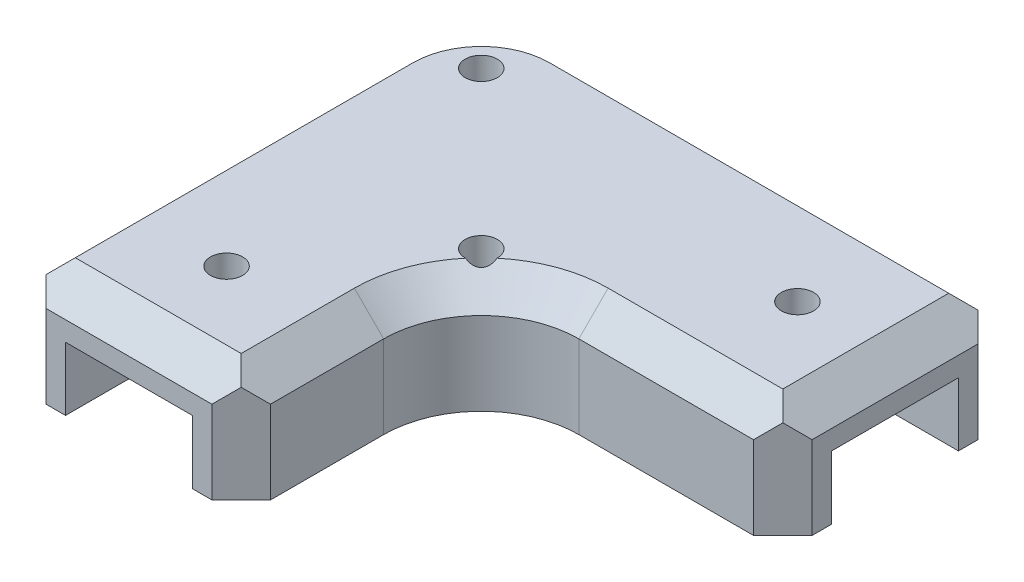
ISO-10303-21;
HEADER;
FILE_DESCRIPTION(('STEP AP214'),'2;1');
FILE_NAME('part.step','',(''),(''),'','','');
FILE_SCHEMA(('AUTOMOTIVE_DESIGN { 1 0 10303 214 1 1 1 1 }'));
ENDSEC;
DATA;
#1=APPLICATION_CONTEXT('core data for automotive mechanical design processes');
#2=APPLICATION_PROTOCOL_DEFINITION('international standard','automotive_design',2000,#1);
#3=PRODUCT_CONTEXT('',#1,'mechanical');
#4=PRODUCT('Part','Part','',(#3));
#5=PRODUCT_RELATED_PRODUCT_CATEGORY('part','',(#4));
#6=PRODUCT_DEFINITION_FORMATION('','',#4);
#7=PRODUCT_DEFINITION_CONTEXT('part definition',#1,'design');
#8=PRODUCT_DEFINITION('design','',#6,#7);
#9=PRODUCT_DEFINITION_SHAPE('','',#8);
#10=(LENGTH_UNIT() NAMED_UNIT(*) SI_UNIT(.MILLI.,.METRE.));
#11=(NAMED_UNIT(*) PLANE_ANGLE_UNIT() SI_UNIT($,.RADIAN.));
#12=(NAMED_UNIT(*) SI_UNIT($,.STERADIAN.) SOLID_ANGLE_UNIT());
#13=UNCERTAINTY_MEASURE_WITH_UNIT(LENGTH_MEASURE(1.E-05),#10,'distance_accuracy_value','');
#14=(GEOMETRIC_REPRESENTATION_CONTEXT(3) GLOBAL_UNCERTAINTY_ASSIGNED_CONTEXT((#13)) GLOBAL_UNIT_ASSIGNED_CONTEXT((#10,
#11,#12)) REPRESENTATION_CONTEXT('',''));
#15=CARTESIAN_POINT('',(0.,0.,0.));
#16=DIRECTION('',(0.,0.,1.));
#17=DIRECTION('',(1.,0.,0.));
#18=AXIS2_PLACEMENT_3D('',#15,#16,#17);
#19=CARTESIAN_POINT('',(0.,0.,47.6));
#20=DIRECTION('',(1.,0.,0.));
#21=DIRECTION('',(0.,0.,-1.));
#22=AXIS2_PLACEMENT_3D('',#19,#20,#21);
#23=PLANE('',#22);
#24=DIRECTION('',(0.,0.,-1.));
#25=VECTOR('',#24,1.);
#26=CARTESIAN_POINT('',(0.,6.5,47.6));
#27=LINE('',#26,#25);
#28=CARTESIAN_POINT('',(0.,6.5,47.6));
#29=VERTEX_POINT('',#28);
#30=CARTESIAN_POINT('',(0.,6.5,18.));
#31=VERTEX_POINT('',#30);
#32=EDGE_CURVE('E582',#29,#31,#27,.T.);
#33=ORIENTED_EDGE('',*,*,#32,.T.);
#34=DIRECTION('',(0.,1.,0.));
#35=VECTOR('',#34,1.);
#36=CARTESIAN_POINT('',(0.,6.5,18.));
#37=LINE('',#36,#35);
#38=CARTESIAN_POINT('',(0.,13.,18.));
#39=VERTEX_POINT('',#38);
#40=EDGE_CURVE('E566',#31,#39,#37,.T.);
#41=ORIENTED_EDGE('',*,*,#40,.T.);
#42=DIRECTION('',(0.,0.,-1.));
#43=VECTOR('',#42,1.);
#44=CARTESIAN_POINT('',(0.,13.,47.6));
#45=LINE('',#44,#43);
#46=CARTESIAN_POINT('',(0.,13.,47.6));
#47=VERTEX_POINT('',#46);
#48=EDGE_CURVE('E272',#47,#39,#45,.T.);
#49=ORIENTED_EDGE('',*,*,#48,.F.);
#50=DIRECTION('',(0.,-1.,0.));
#51=VECTOR('',#50,1.);
#52=CARTESIAN_POINT('',(0.,0.,47.6));
#53=LINE('',#52,#51);
#54=EDGE_CURVE('E270',#47,#29,#53,.T.);
#55=ORIENTED_EDGE('',*,*,#54,.T.);
#56=EDGE_LOOP('',(#33,#41,#49,#55));
#57=FACE_BOUND('',#56,.T.);
#58=ADVANCED_FACE('F60',(#57),#23,.T.);
#59=CARTESIAN_POINT('',(0.,13.,47.6));
#60=DIRECTION('',(0.,-1.,0.));
#61=DIRECTION('',(0.,0.,-1.));
#62=AXIS2_PLACEMENT_3D('',#59,#60,#61);
#63=PLANE('',#62);
#64=CARTESIAN_POINT('',(38.9,13.,11.5));
#65=DIRECTION('',(0.,-1.,0.));
#66=DIRECTION('',(1.,0.,0.));
#67=AXIS2_PLACEMENT_3D('',#64,#65,#66);
#68=CIRCLE('',#67,1.65);
#69=CARTESIAN_POINT('',(40.55,13.,11.5));
#70=VERTEX_POINT('',#69);
#71=EDGE_CURVE('E593',#70,#70,#68,.T.);
#72=ORIENTED_EDGE('',*,*,#71,.F.);
#73=EDGE_LOOP('',(#72));
#74=FACE_BOUND('',#73,.T.);
#75=CARTESIAN_POINT('',(6.5,13.,37.6));
#76=DIRECTION('',(0.,-1.,0.));
#77=DIRECTION('',(0.,0.,-1.));
#78=AXIS2_PLACEMENT_3D('',#75,#76,#77);
#79=CIRCLE('',#78,1.65);
#80=CARTESIAN_POINT('',(6.5,13.,35.95));
#81=VERTEX_POINT('',#80);
#82=EDGE_CURVE('E284',#81,#81,#79,.T.);
#83=ORIENTED_EDGE('',*,*,#82,.F.);
#84=EDGE_LOOP('',(#83));
#85=FACE_BOUND('',#84,.T.);
#86=ORIENTED_EDGE('',*,*,#48,.T.);
#87=DIRECTION('',(-0.707106781186547,0.,0.707106781186548));
#88=VECTOR('',#87,1.);
#89=CARTESIAN_POINT('',(13.,13.,5.));
#90=LINE('',#89,#88);
#91=CARTESIAN_POINT('',(13.,13.,5.));
#92=VERTEX_POINT('',#91);
#93=EDGE_CURVE('E554',#92,#39,#90,.T.);
#94=ORIENTED_EDGE('',*,*,#93,.F.);
#95=DIRECTION('',(-1.,0.,0.));
#96=VECTOR('',#95,1.);
#97=CARTESIAN_POINT('',(48.9,13.,5.));
#98=LINE('',#97,#96);
#99=CARTESIAN_POINT('',(48.9,13.,5.));
#100=VERTEX_POINT('',#99);
#101=EDGE_CURVE('E287',#100,#92,#98,.T.);
#102=ORIENTED_EDGE('',*,*,#101,.F.);
#103=DIRECTION('',(0.,0.,1.));
#104=VECTOR('',#103,1.);
#105=CARTESIAN_POINT('',(48.9,13.,5.));
#106=LINE('',#105,#104);
#107=CARTESIAN_POINT('',(48.9,13.,18.));
#108=VERTEX_POINT('',#107);
#109=EDGE_CURVE('E601',#100,#108,#106,.T.);
#110=ORIENTED_EDGE('',*,*,#109,.T.);
#111=DIRECTION('',(-1.,0.,0.));
#112=VECTOR('',#111,1.);
#113=CARTESIAN_POINT('',(48.9,13.,18.));
#114=LINE('',#113,#112);
#115=CARTESIAN_POINT('',(16.,13.,18.));
#116=VERTEX_POINT('',#115);
#117=EDGE_CURVE('E603',#108,#116,#114,.T.);
#118=ORIENTED_EDGE('',*,*,#117,.T.);
#119=DIRECTION('',(0.707106781186546,0.,-0.707106781186549));
#120=VECTOR('',#119,1.);
#121=CARTESIAN_POINT('',(16.,13.,18.));
#122=LINE('',#121,#120);
#123=CARTESIAN_POINT('',(13.,13.,21.));
#124=VERTEX_POINT('',#123);
#125=EDGE_CURVE('E290',#116,#124,#122,.F.);
#126=ORIENTED_EDGE('',*,*,#125,.T.);
#127=DIRECTION('',(0.,0.,-1.));
#128=VECTOR('',#127,1.);
#129=CARTESIAN_POINT('',(13.,13.,47.6));
#130=LINE('',#129,#128);
#131=CARTESIAN_POINT('',(13.,13.,47.6));
#132=VERTEX_POINT('',#131);
#133=EDGE_CURVE('E281',#132,#124,#130,.T.);
#134=ORIENTED_EDGE('',*,*,#133,.F.);
#135=DIRECTION('',(-1.,0.,0.));
#136=VECTOR('',#135,1.);
#137=CARTESIAN_POINT('',(0.,13.,47.6));
#138=LINE('',#137,#136);
#139=EDGE_CURVE('E269',#132,#47,#138,.T.);
#140=ORIENTED_EDGE('',*,*,#139,.T.);
#141=EDGE_LOOP('',(#86,#94,#102,#110,#118,#126,#134,#140));
#142=FACE_BOUND('',#141,.T.);
#143=ADVANCED_FACE('F391',(#74,#85,#142),#63,.T.);
#144=CARTESIAN_POINT('',(13.,0.,47.6));
#145=DIRECTION('',(-1.,0.,0.));
#146=DIRECTION('',(0.,0.,1.));
#147=AXIS2_PLACEMENT_3D('',#144,#145,#146);
#148=PLANE('',#147);
#149=DIRECTION('',(0.,-1.,0.));
#150=VECTOR('',#149,1.);
#151=CARTESIAN_POINT('',(13.,0.,21.));
#152=LINE('',#151,#150);
#153=CARTESIAN_POINT('',(13.,6.5,21.));
#154=VERTEX_POINT('',#153);
#155=EDGE_CURVE('E263',#124,#154,#152,.T.);
#156=ORIENTED_EDGE('',*,*,#155,.T.);
#157=DIRECTION('',(0.,0.,1.));
#158=VECTOR('',#157,1.);
#159=CARTESIAN_POINT('',(13.,6.5,47.6));
#160=LINE('',#159,#158);
#161=CARTESIAN_POINT('',(13.,6.5,47.6));
#162=VERTEX_POINT('',#161);
#163=EDGE_CURVE('E244',#154,#162,#160,.T.);
#164=ORIENTED_EDGE('',*,*,#163,.T.);
#165=DIRECTION('',(0.,1.,0.));
#166=VECTOR('',#165,1.);
#167=CARTESIAN_POINT('',(13.,0.,47.6));
#168=LINE('',#167,#166);
#169=EDGE_CURVE('E260',#162,#132,#168,.T.);
#170=ORIENTED_EDGE('',*,*,#169,.T.);
#171=ORIENTED_EDGE('',*,*,#133,.T.);
#172=EDGE_LOOP('',(#156,#164,#170,#171));
#173=FACE_BOUND('',#172,.T.);
#174=ADVANCED_FACE('F258',(#173),#148,.T.);
#175=CARTESIAN_POINT('',(48.9,0.,0.));
#176=DIRECTION('',(1.,0.,0.));
#177=DIRECTION('',(0.,0.,-1.));
#178=AXIS2_PLACEMENT_3D('',#175,#176,#177);
#179=PLANE('',#178);
#180=DIRECTION('',(0.,0.,1.));
#181=VECTOR('',#180,1.);
#182=CARTESIAN_POINT('',(48.9,15.,19.9999999999999));
#183=LINE('',#182,#181);
#184=CARTESIAN_POINT('',(48.9,15.,2.99999999999999));
#185=VERTEX_POINT('',#184);
#186=CARTESIAN_POINT('',(48.9,15.,20.));
#187=VERTEX_POINT('',#186);
#188=EDGE_CURVE('E518',#185,#187,#183,.T.);
#189=ORIENTED_EDGE('',*,*,#188,.T.);
#190=DIRECTION('',(0.,-1.,0.));
#191=VECTOR('',#190,1.);
#192=CARTESIAN_POINT('',(48.9,6.5,20.));
#193=LINE('',#192,#191);
#194=CARTESIAN_POINT('',(48.9,6.5,20.));
#195=VERTEX_POINT('',#194);
#196=EDGE_CURVE('E505',#187,#195,#193,.T.);
#197=ORIENTED_EDGE('',*,*,#196,.T.);
#198=DIRECTION('',(0.,0.,1.));
#199=VECTOR('',#198,1.);
#200=CARTESIAN_POINT('',(48.9,6.5,47.6));
#201=LINE('',#200,#199);
#202=CARTESIAN_POINT('',(48.9,6.5,18.));
#203=VERTEX_POINT('',#202);
#204=EDGE_CURVE('E574',#203,#195,#201,.T.);
#205=ORIENTED_EDGE('',*,*,#204,.F.);
#206=DIRECTION('',(0.,-1.,0.));
#207=VECTOR('',#206,1.);
#208=CARTESIAN_POINT('',(48.9,0.,18.));
#209=LINE('',#208,#207);
#210=EDGE_CURVE('E596',#108,#203,#209,.T.);
#211=ORIENTED_EDGE('',*,*,#210,.F.);
#212=ORIENTED_EDGE('',*,*,#109,.F.);
#213=DIRECTION('',(0.,1.,0.));
#214=VECTOR('',#213,1.);
#215=CARTESIAN_POINT('',(48.9,0.,5.));
#216=LINE('',#215,#214);
#217=CARTESIAN_POINT('',(48.9,6.5,5.));
#218=VERTEX_POINT('',#217);
#219=EDGE_CURVE('E599',#218,#100,#216,.T.);
#220=ORIENTED_EDGE('',*,*,#219,.F.);
#221=CARTESIAN_POINT('',(48.9,6.5,2.99999999999999));
#222=VERTEX_POINT('',#221);
#223=EDGE_CURVE('E575',#222,#218,#201,.T.);
#224=ORIENTED_EDGE('',*,*,#223,.F.);
#225=DIRECTION('',(0.,1.,0.));
#226=VECTOR('',#225,1.);
#227=CARTESIAN_POINT('',(48.9,15.,2.99999999999999));
#228=LINE('',#227,#226);
#229=EDGE_CURVE('E453',#222,#185,#228,.T.);
#230=ORIENTED_EDGE('',*,*,#229,.T.);
#231=EDGE_LOOP('',(#189,#197,#205,#211,#212,#220,#224,#230));
#232=FACE_BOUND('',#231,.T.);
#233=ADVANCED_FACE('F375',(#232),#179,.T.);
#234=CARTESIAN_POINT('',(48.9,0.,18.));
#235=DIRECTION('',(0.,0.,-1.));
#236=DIRECTION('',(-1.,0.,0.));
#237=AXIS2_PLACEMENT_3D('',#234,#235,#236);
#238=PLANE('',#237);
#239=ORIENTED_EDGE('',*,*,#210,.T.);
#240=DIRECTION('',(-1.,0.,0.));
#241=VECTOR('',#240,1.);
#242=CARTESIAN_POINT('',(48.9,6.5,18.));
#243=LINE('',#242,#241);
#244=CARTESIAN_POINT('',(16.,6.5,18.));
#245=VERTEX_POINT('',#244);
#246=EDGE_CURVE('E253',#203,#245,#243,.T.);
#247=ORIENTED_EDGE('',*,*,#246,.T.);
#248=DIRECTION('',(0.,1.,0.));
#249=VECTOR('',#248,1.);
#250=CARTESIAN_POINT('',(16.,0.,18.));
#251=LINE('',#250,#249);
#252=EDGE_CURVE('E283',#245,#116,#251,.T.);
#253=ORIENTED_EDGE('',*,*,#252,.T.);
#254=ORIENTED_EDGE('',*,*,#117,.F.);
#255=EDGE_LOOP('',(#239,#247,#253,#254));
#256=FACE_BOUND('',#255,.T.);
#257=ADVANCED_FACE('F371',(#256),#238,.T.);
#258=CARTESIAN_POINT('',(48.9,0.,5.));
#259=DIRECTION('',(0.,0.,1.));
#260=DIRECTION('',(1.,0.,0.));
#261=AXIS2_PLACEMENT_3D('',#258,#259,#260);
#262=PLANE('',#261);
#263=DIRECTION('',(0.,-1.,0.));
#264=VECTOR('',#263,1.);
#265=CARTESIAN_POINT('',(13.,0.,5.));
#266=LINE('',#265,#264);
#267=CARTESIAN_POINT('',(13.,6.5,5.));
#268=VERTEX_POINT('',#267);
#269=EDGE_CURVE('E587',#92,#268,#266,.T.);
#270=ORIENTED_EDGE('',*,*,#269,.T.);
#271=DIRECTION('',(1.,0.,0.));
#272=VECTOR('',#271,1.);
#273=CARTESIAN_POINT('',(48.9,6.5,5.));
#274=LINE('',#273,#272);
#275=EDGE_CURVE('E584',#268,#218,#274,.T.);
#276=ORIENTED_EDGE('',*,*,#275,.T.);
#277=ORIENTED_EDGE('',*,*,#219,.T.);
#278=ORIENTED_EDGE('',*,*,#101,.T.);
#279=EDGE_LOOP('',(#270,#276,#277,#278));
#280=FACE_BOUND('',#279,.T.);
#281=ADVANCED_FACE('F368',(#280),#262,.T.);
#282=CARTESIAN_POINT('',(0.,0.,47.6));
#283=DIRECTION('',(0.,0.,1.));
#284=DIRECTION('',(1.,0.,0.));
#285=AXIS2_PLACEMENT_3D('',#282,#283,#284);
#286=PLANE('',#285);
#287=DIRECTION('',(-1.,0.,0.));
#288=VECTOR('',#287,1.);
#289=CARTESIAN_POINT('',(-5.,6.5,47.6));
#290=LINE('',#289,#288);
#291=CARTESIAN_POINT('',(15.,6.5,47.6));
#292=VERTEX_POINT('',#291);
#293=EDGE_CURVE('E240',#292,#162,#290,.T.);
#294=ORIENTED_EDGE('',*,*,#293,.F.);
#295=DIRECTION('',(0.,1.,0.));
#296=VECTOR('',#295,1.);
#297=CARTESIAN_POINT('',(15.,15.,47.6));
#298=LINE('',#297,#296);
#299=CARTESIAN_POINT('',(15.,15.,47.6));
#300=VERTEX_POINT('',#299);
#301=EDGE_CURVE('E490',#292,#300,#298,.T.);
#302=ORIENTED_EDGE('',*,*,#301,.T.);
#303=DIRECTION('',(-1.,0.,0.));
#304=VECTOR('',#303,1.);
#305=CARTESIAN_POINT('',(-2.,15.,47.6));
#306=LINE('',#305,#304);
#307=CARTESIAN_POINT('',(-2.,15.,47.6));
#308=VERTEX_POINT('',#307);
#309=EDGE_CURVE('E484',#300,#308,#306,.T.);
#310=ORIENTED_EDGE('',*,*,#309,.T.);
#311=DIRECTION('',(0.,-1.,0.));
#312=VECTOR('',#311,1.);
#313=CARTESIAN_POINT('',(-2.,6.5,47.6));
#314=LINE('',#313,#312);
#315=CARTESIAN_POINT('',(-2.,6.5,47.6));
#316=VERTEX_POINT('',#315);
#317=EDGE_CURVE('E489',#308,#316,#314,.T.);
#318=ORIENTED_EDGE('',*,*,#317,.T.);
#319=EDGE_CURVE('E254',#29,#316,#290,.T.);
#320=ORIENTED_EDGE('',*,*,#319,.F.);
#321=ORIENTED_EDGE('',*,*,#54,.F.);
#322=ORIENTED_EDGE('',*,*,#139,.F.);
#323=ORIENTED_EDGE('',*,*,#169,.F.);
#324=EDGE_LOOP('',(#294,#302,#310,#318,#320,#321,#322,#323));
#325=FACE_BOUND('',#324,.T.);
#326=ADVANCED_FACE('F267',(#325),#286,.T.);
#327=CARTESIAN_POINT('',(-5.,18.,47.6));
#328=DIRECTION('',(1.,0.,0.));
#329=DIRECTION('',(0.,1.,0.));
#330=AXIS2_PLACEMENT_3D('',#327,#328,#329);
#331=PLANE('',#330);
#332=DIRECTION('',(0.,0.,-1.));
#333=VECTOR('',#332,1.);
#334=CARTESIAN_POINT('',(-5.,6.5,47.6));
#335=LINE('',#334,#333);
#336=CARTESIAN_POINT('',(-5.,6.5,44.6));
#337=VERTEX_POINT('',#336);
#338=CARTESIAN_POINT('',(-5.,6.5,10.));
#339=VERTEX_POINT('',#338);
#340=EDGE_CURVE('E569',#337,#339,#335,.T.);
#341=ORIENTED_EDGE('',*,*,#340,.F.);
#342=DIRECTION('',(0.,1.,0.));
#343=VECTOR('',#342,1.);
#344=CARTESIAN_POINT('',(-5.,15.,44.6));
#345=LINE('',#344,#343);
#346=CARTESIAN_POINT('',(-5.,15.,44.6));
#347=VERTEX_POINT('',#346);
#348=EDGE_CURVE('E83',#337,#347,#345,.T.);
#349=ORIENTED_EDGE('',*,*,#348,.T.);
#350=DIRECTION('',(0.,0.,-1.));
#351=VECTOR('',#350,1.);
#352=CARTESIAN_POINT('',(-5.,15.,47.6));
#353=LINE('',#352,#351);
#354=CARTESIAN_POINT('',(-5.,15.,10.));
#355=VERTEX_POINT('',#354);
#356=EDGE_CURVE('E477',#347,#355,#353,.T.);
#357=ORIENTED_EDGE('',*,*,#356,.T.);
#358=DIRECTION('',(0.,-1.,0.));
#359=VECTOR('',#358,1.);
#360=CARTESIAN_POINT('',(-5.,18.,10.));
#361=LINE('',#360,#359);
#362=EDGE_CURVE('E294',#355,#339,#361,.T.);
#363=ORIENTED_EDGE('',*,*,#362,.T.);
#364=EDGE_LOOP('',(#341,#349,#357,#363));
#365=FACE_BOUND('',#364,.T.);
#366=ADVANCED_FACE('F402',(#365),#331,.F.);
#367=CARTESIAN_POINT('',(18.,18.,47.6));
#368=DIRECTION('',(-1.,0.,0.));
#369=DIRECTION('',(0.,-1.,0.));
#370=AXIS2_PLACEMENT_3D('',#367,#368,#369);
#371=PLANE('',#370);
#372=DIRECTION('',(0.,0.,1.));
#373=VECTOR('',#372,1.);
#374=CARTESIAN_POINT('',(18.,15.,47.6));
#375=LINE('',#374,#373);
#376=CARTESIAN_POINT('',(18.,15.,33.));
#377=VERTEX_POINT('',#376);
#378=CARTESIAN_POINT('',(18.,15.,44.6));
#379=VERTEX_POINT('',#378);
#380=EDGE_CURVE('E326',#377,#379,#375,.T.);
#381=ORIENTED_EDGE('',*,*,#380,.T.);
#382=DIRECTION('',(0.,-1.,0.));
#383=VECTOR('',#382,1.);
#384=CARTESIAN_POINT('',(18.,6.5,44.6));
#385=LINE('',#384,#383);
#386=CARTESIAN_POINT('',(18.,6.5,44.6));
#387=VERTEX_POINT('',#386);
#388=EDGE_CURVE('E460',#379,#387,#385,.T.);
#389=ORIENTED_EDGE('',*,*,#388,.T.);
#390=DIRECTION('',(0.,0.,1.));
#391=VECTOR('',#390,1.);
#392=CARTESIAN_POINT('',(18.,6.5,47.6));
#393=LINE('',#392,#391);
#394=CARTESIAN_POINT('',(18.,6.5,33.));
#395=VERTEX_POINT('',#394);
#396=EDGE_CURVE('E544',#395,#387,#393,.T.);
#397=ORIENTED_EDGE('',*,*,#396,.F.);
#398=DIRECTION('',(0.,-1.,0.));
#399=VECTOR('',#398,1.);
#400=CARTESIAN_POINT('',(18.,18.,33.));
#401=LINE('',#400,#399);
#402=EDGE_CURVE('E305',#395,#377,#401,.F.);
#403=ORIENTED_EDGE('',*,*,#402,.T.);
#404=EDGE_LOOP('',(#381,#389,#397,#403));
#405=FACE_BOUND('',#404,.T.);
#406=ADVANCED_FACE('F384',(#405),#371,.F.);
#407=CARTESIAN_POINT('',(38.9,18.,23.));
#408=DIRECTION('',(0.,0.,-1.));
#409=DIRECTION('',(0.,1.,0.));
#410=AXIS2_PLACEMENT_3D('',#407,#408,#409);
#411=PLANE('',#410);
#412=DIRECTION('',(-1.,0.,0.));
#413=VECTOR('',#412,1.);
#414=CARTESIAN_POINT('',(38.9,6.5,23.));
#415=LINE('',#414,#413);
#416=CARTESIAN_POINT('',(45.9,6.5,23.));
#417=VERTEX_POINT('',#416);
#418=CARTESIAN_POINT('',(28.,6.5,23.));
#419=VERTEX_POINT('',#418);
#420=EDGE_CURVE('E264',#417,#419,#415,.T.);
#421=ORIENTED_EDGE('',*,*,#420,.F.);
#422=DIRECTION('',(0.,1.,0.));
#423=VECTOR('',#422,1.);
#424=CARTESIAN_POINT('',(45.9,15.,23.));
#425=LINE('',#424,#423);
#426=CARTESIAN_POINT('',(45.9,15.,23.));
#427=VERTEX_POINT('',#426);
#428=EDGE_CURVE('E500',#417,#427,#425,.T.);
#429=ORIENTED_EDGE('',*,*,#428,.T.);
#430=DIRECTION('',(-1.,0.,0.));
#431=VECTOR('',#430,1.);
#432=CARTESIAN_POINT('',(38.9,15.,23.));
#433=LINE('',#432,#431);
#434=CARTESIAN_POINT('',(28.,15.,23.));
#435=VERTEX_POINT('',#434);
#436=EDGE_CURVE('E329',#427,#435,#433,.T.);
#437=ORIENTED_EDGE('',*,*,#436,.T.);
#438=DIRECTION('',(0.,-1.,0.));
#439=VECTOR('',#438,1.);
#440=CARTESIAN_POINT('',(28.,6.5,23.));
#441=LINE('',#440,#439);
#442=EDGE_CURVE('E302',#435,#419,#441,.T.);
#443=ORIENTED_EDGE('',*,*,#442,.T.);
#444=EDGE_LOOP('',(#421,#429,#437,#443));
#445=FACE_BOUND('',#444,.T.);
#446=ADVANCED_FACE('F380',(#445),#411,.F.);
#447=CARTESIAN_POINT('',(0.,0.,0.));
#448=DIRECTION('',(0.,0.,1.));
#449=DIRECTION('',(1.,0.,0.));
#450=AXIS2_PLACEMENT_3D('',#447,#448,#449);
#451=PLANE('',#450);
#452=DIRECTION('',(1.,0.,0.));
#453=VECTOR('',#452,1.);
#454=CARTESIAN_POINT('',(0.,15.,0.));
#455=LINE('',#454,#453);
#456=CARTESIAN_POINT('',(5.,15.,0.));
#457=VERTEX_POINT('',#456);
#458=CARTESIAN_POINT('',(45.9,15.,0.));
#459=VERTEX_POINT('',#458);
#460=EDGE_CURVE('E535',#457,#459,#455,.T.);
#461=ORIENTED_EDGE('',*,*,#460,.T.);
#462=DIRECTION('',(0.,-1.,0.));
#463=VECTOR('',#462,1.);
#464=CARTESIAN_POINT('',(45.9,6.5,0.));
#465=LINE('',#464,#463);
#466=CARTESIAN_POINT('',(45.9,6.5,0.));
#467=VERTEX_POINT('',#466);
#468=EDGE_CURVE('E12',#459,#467,#465,.T.);
#469=ORIENTED_EDGE('',*,*,#468,.T.);
#470=DIRECTION('',(1.,0.,0.));
#471=VECTOR('',#470,1.);
#472=CARTESIAN_POINT('',(-5.,6.5,0.));
#473=LINE('',#472,#471);
#474=CARTESIAN_POINT('',(5.,6.5,0.));
#475=VERTEX_POINT('',#474);
#476=EDGE_CURVE('E571',#475,#467,#473,.T.);
#477=ORIENTED_EDGE('',*,*,#476,.F.);
#478=DIRECTION('',(0.,-1.,0.));
#479=VECTOR('',#478,1.);
#480=CARTESIAN_POINT('',(5.,0.,0.));
#481=LINE('',#480,#479);
#482=EDGE_CURVE('E299',#475,#457,#481,.F.);
#483=ORIENTED_EDGE('',*,*,#482,.T.);
#484=EDGE_LOOP('',(#461,#469,#477,#483));
#485=FACE_BOUND('',#484,.T.);
#486=ADVANCED_FACE('F383',(#485),#451,.F.);
#487=CARTESIAN_POINT('',(16.,0.,18.));
#488=DIRECTION('',(0.707106781186549,0.,0.707106781186546));
#489=DIRECTION('',(0.,1.,0.));
#490=AXIS2_PLACEMENT_3D('',#487,#488,#489);
#491=PLANE('',#490);
#492=ORIENTED_EDGE('',*,*,#252,.F.);
#493=DIRECTION('',(0.707106781186546,0.,-0.707106781186549));
#494=VECTOR('',#493,1.);
#495=CARTESIAN_POINT('',(16.,6.5,18.));
#496=LINE('',#495,#494);
#497=EDGE_CURVE('E292',#245,#154,#496,.F.);
#498=ORIENTED_EDGE('',*,*,#497,.T.);
#499=ORIENTED_EDGE('',*,*,#155,.F.);
#500=ORIENTED_EDGE('',*,*,#125,.F.);
#501=EDGE_LOOP('',(#492,#498,#499,#500));
#502=FACE_BOUND('',#501,.T.);
#503=ADVANCED_FACE('F389',(#502),#491,.F.);
#504=CARTESIAN_POINT('',(6.5,29.,37.6));
#505=DIRECTION('',(0.,-1.,0.));
#506=DIRECTION('',(0.,0.,-1.));
#507=AXIS2_PLACEMENT_3D('',#504,#505,#506);
#508=CYLINDRICAL_SURFACE('',#507,1.65);
#509=ORIENTED_EDGE('',*,*,#82,.T.);
#510=EDGE_LOOP('',(#509));
#511=FACE_BOUND('',#510,.T.);
#512=CARTESIAN_POINT('',(6.5,18.,37.6));
#513=DIRECTION('',(0.,-1.,0.));
#514=DIRECTION('',(0.,0.,-1.));
#515=AXIS2_PLACEMENT_3D('',#512,#513,#514);
#516=CIRCLE('',#515,1.65);
#517=CARTESIAN_POINT('',(6.5,18.,35.95));
#518=VERTEX_POINT('',#517);
#519=EDGE_CURVE('E275',#518,#518,#516,.T.);
#520=ORIENTED_EDGE('',*,*,#519,.F.);
#521=EDGE_LOOP('',(#520));
#522=FACE_BOUND('',#521,.T.);
#523=ADVANCED_FACE('F386',(#511,#522),#508,.F.);
#524=CARTESIAN_POINT('',(-5.,18.,47.6));
#525=DIRECTION('',(0.,-1.,0.));
#526=DIRECTION('',(0.,0.,-1.));
#527=AXIS2_PLACEMENT_3D('',#524,#525,#526);
#528=PLANE('',#527);
#529=CARTESIAN_POINT('',(2.,18.,7.));
#530=DIRECTION('',(0.,-1.,0.));
#531=DIRECTION('',(0.,0.,-1.));
#532=AXIS2_PLACEMENT_3D('',#529,#530,#531);
#533=CIRCLE('',#532,1.65);
#534=CARTESIAN_POINT('',(2.,18.,5.35));
#535=VERTEX_POINT('',#534);
#536=EDGE_CURVE('E555',#535,#535,#533,.T.);
#537=ORIENTED_EDGE('',*,*,#536,.T.);
#538=EDGE_LOOP('',(#537));
#539=FACE_BOUND('',#538,.T.);
#540=DIRECTION('',(1.,0.,0.));
#541=VECTOR('',#540,1.);
#542=CARTESIAN_POINT('',(-5.,18.,19.9999999999999));
#543=LINE('',#542,#541);
#544=CARTESIAN_POINT('',(28.,18.,19.9999999999999));
#545=VERTEX_POINT('',#544);
#546=CARTESIAN_POINT('',(45.9,18.,19.9999999999999));
#547=VERTEX_POINT('',#546);
#548=EDGE_CURVE('E319',#545,#547,#543,.T.);
#549=ORIENTED_EDGE('',*,*,#548,.T.);
#550=DIRECTION('',(0.,0.,-1.));
#551=VECTOR('',#550,1.);
#552=CARTESIAN_POINT('',(45.9,18.,3.));
#553=LINE('',#552,#551);
#554=CARTESIAN_POINT('',(45.9,18.,3.));
#555=VERTEX_POINT('',#554);
#556=EDGE_CURVE('E513',#547,#555,#553,.T.);
#557=ORIENTED_EDGE('',*,*,#556,.T.);
#558=DIRECTION('',(-1.,0.,0.));
#559=VECTOR('',#558,1.);
#560=CARTESIAN_POINT('',(-5.,18.,3.));
#561=LINE('',#560,#559);
#562=CARTESIAN_POINT('',(5.,18.,3.00000000000001));
#563=VERTEX_POINT('',#562);
#564=EDGE_CURVE('E315',#555,#563,#561,.T.);
#565=ORIENTED_EDGE('',*,*,#564,.T.);
#566=CARTESIAN_POINT('',(5.,18.,10.));
#567=DIRECTION('',(0.,-1.,0.));
#568=DIRECTION('',(0.,0.,-1.));
#569=AXIS2_PLACEMENT_3D('',#566,#567,#568);
#570=CIRCLE('',#569,6.99999999999999);
#571=CARTESIAN_POINT('',(-2.,18.,10.));
#572=VERTEX_POINT('',#571);
#573=EDGE_CURVE('E313',#563,#572,#570,.F.);
#574=ORIENTED_EDGE('',*,*,#573,.T.);
#575=DIRECTION('',(0.,0.,1.));
#576=VECTOR('',#575,1.);
#577=CARTESIAN_POINT('',(-2.,18.,47.6));
#578=LINE('',#577,#576);
#579=CARTESIAN_POINT('',(-2.,18.,44.6));
#580=VERTEX_POINT('',#579);
#581=EDGE_CURVE('E310',#572,#580,#578,.T.);
#582=ORIENTED_EDGE('',*,*,#581,.T.);
#583=DIRECTION('',(1.,0.,0.));
#584=VECTOR('',#583,1.);
#585=CARTESIAN_POINT('',(14.9999999999999,18.,44.6));
#586=LINE('',#585,#584);
#587=CARTESIAN_POINT('',(14.9999999999999,18.,44.6));
#588=VERTEX_POINT('',#587);
#589=EDGE_CURVE('E483',#580,#588,#586,.T.);
#590=ORIENTED_EDGE('',*,*,#589,.T.);
#591=DIRECTION('',(0.,0.,-1.));
#592=VECTOR('',#591,1.);
#593=CARTESIAN_POINT('',(14.9999999999999,18.,47.6));
#594=LINE('',#593,#592);
#595=CARTESIAN_POINT('',(15.,18.,33.));
#596=VERTEX_POINT('',#595);
#597=EDGE_CURVE('E324',#588,#596,#594,.T.);
#598=ORIENTED_EDGE('',*,*,#597,.T.);
#599=CARTESIAN_POINT('',(28.,18.,33.));
#600=DIRECTION('',(0.,-1.,0.));
#601=DIRECTION('',(0.,0.,-1.));
#602=AXIS2_PLACEMENT_3D('',#599,#600,#601);
#603=CIRCLE('',#602,13.0000000000001);
#604=CARTESIAN_POINT('',(18.0365294125858,18.,24.6495955874141));
#605=VERTEX_POINT('',#604);
#606=EDGE_CURVE('E322',#596,#605,#603,.T.);
#607=ORIENTED_EDGE('',*,*,#606,.T.);
#608=CARTESIAN_POINT('',(18.,18.,23.));
#609=DIRECTION('',(0.,-1.,0.));
#610=DIRECTION('',(0.,0.,-1.));
#611=AXIS2_PLACEMENT_3D('',#608,#609,#610);
#612=CIRCLE('',#611,1.65);
#613=CARTESIAN_POINT('',(19.6495955874141,18.,23.0365294125858));
#614=VERTEX_POINT('',#613);
#615=EDGE_CURVE('E552',#605,#614,#612,.T.);
#616=ORIENTED_EDGE('',*,*,#615,.T.);
#617=CARTESIAN_POINT('',(28.,18.,33.));
#618=DIRECTION('',(0.,-1.,0.));
#619=DIRECTION('',(0.,0.,-1.));
#620=AXIS2_PLACEMENT_3D('',#617,#618,#619);
#621=CIRCLE('',#620,13.0000000000001);
#622=EDGE_CURVE('E317',#614,#545,#621,.T.);
#623=ORIENTED_EDGE('',*,*,#622,.T.);
#624=EDGE_LOOP('',(#549,#557,#565,#574,#582,#590,#598,#607,#616,#623));
#625=FACE_BOUND('',#624,.T.);
#626=CARTESIAN_POINT('',(38.9,18.,11.5));
#627=DIRECTION('',(0.,1.,0.));
#628=DIRECTION('',(0.,0.,1.));
#629=AXIS2_PLACEMENT_3D('',#626,#627,#628);
#630=CIRCLE('',#629,1.65);
#631=CARTESIAN_POINT('',(38.9,18.,13.15));
#632=VERTEX_POINT('',#631);
#633=EDGE_CURVE('E590',#632,#632,#630,.T.);
#634=ORIENTED_EDGE('',*,*,#633,.F.);
#635=EDGE_LOOP('',(#634));
#636=FACE_BOUND('',#635,.T.);
#637=ORIENTED_EDGE('',*,*,#519,.T.);
#638=EDGE_LOOP('',(#637));
#639=FACE_BOUND('',#638,.T.);
#640=ADVANCED_FACE('F366',(#539,#625,#636,#639),#528,.F.);
#641=CARTESIAN_POINT('',(38.9,-21.,11.5));
#642=DIRECTION('',(0.,1.,0.));
#643=DIRECTION('',(0.,0.,1.));
#644=AXIS2_PLACEMENT_3D('',#641,#642,#643);
#645=CYLINDRICAL_SURFACE('',#644,1.65);
#646=ORIENTED_EDGE('',*,*,#71,.T.);
#647=EDGE_LOOP('',(#646));
#648=FACE_BOUND('',#647,.T.);
#649=ORIENTED_EDGE('',*,*,#633,.T.);
#650=EDGE_LOOP('',(#649));
#651=FACE_BOUND('',#650,.T.);
#652=ADVANCED_FACE('F363',(#648,#651),#645,.F.);
#653=CARTESIAN_POINT('',(0.,6.5,0.));
#654=DIRECTION('',(0.,-1.,0.));
#655=DIRECTION('',(0.,0.,-1.));
#656=AXIS2_PLACEMENT_3D('',#653,#654,#655);
#657=PLANE('',#656);
#658=CARTESIAN_POINT('',(18.,6.5,23.));
#659=DIRECTION('',(0.,-1.,0.));
#660=DIRECTION('',(0.,0.,-1.));
#661=AXIS2_PLACEMENT_3D('',#658,#659,#660);
#662=CIRCLE('',#661,1.65);
#663=CARTESIAN_POINT('',(18.,6.5,21.35));
#664=VERTEX_POINT('',#663);
#665=EDGE_CURVE('E531',#664,#664,#662,.T.);
#666=ORIENTED_EDGE('',*,*,#665,.F.);
#667=EDGE_LOOP('',(#666));
#668=FACE_BOUND('',#667,.T.);
#669=ORIENTED_EDGE('',*,*,#204,.T.);
#670=DIRECTION('',(-0.70710678118655,0.,0.707106781186545));
#671=VECTOR('',#670,1.);
#672=CARTESIAN_POINT('',(34.4499999999998,6.5,34.4500000000001));
#673=LINE('',#672,#671);
#674=EDGE_CURVE('E502',#195,#417,#673,.T.);
#675=ORIENTED_EDGE('',*,*,#674,.T.);
#676=ORIENTED_EDGE('',*,*,#420,.T.);
#677=CARTESIAN_POINT('',(28.,6.5,33.));
#678=DIRECTION('',(0.,-1.,0.));
#679=DIRECTION('',(0.,0.,-1.));
#680=AXIS2_PLACEMENT_3D('',#677,#678,#679);
#681=CIRCLE('',#680,10.);
#682=EDGE_CURVE('E308',#419,#395,#681,.F.);
#683=ORIENTED_EDGE('',*,*,#682,.T.);
#684=ORIENTED_EDGE('',*,*,#396,.T.);
#685=DIRECTION('',(-0.707106781186546,0.,0.707106781186549));
#686=VECTOR('',#685,1.);
#687=CARTESIAN_POINT('',(31.3000000000001,6.5,31.2999999999999));
#688=LINE('',#687,#686);
#689=EDGE_CURVE('E248',#387,#292,#688,.T.);
#690=ORIENTED_EDGE('',*,*,#689,.T.);
#691=ORIENTED_EDGE('',*,*,#293,.T.);
#692=ORIENTED_EDGE('',*,*,#163,.F.);
#693=ORIENTED_EDGE('',*,*,#497,.F.);
#694=ORIENTED_EDGE('',*,*,#246,.F.);
#695=EDGE_LOOP('',(#669,#675,#676,#683,#684,#690,#691,#692,#693,#694));
#696=FACE_BOUND('',#695,.T.);
#697=ADVANCED_FACE('F243',(#668,#696),#657,.T.);
#698=CARTESIAN_POINT('',(2.,6.5,7.));
#699=DIRECTION('',(0.,-1.,0.));
#700=DIRECTION('',(0.,0.,-1.));
#701=AXIS2_PLACEMENT_3D('',#698,#699,#700);
#702=CIRCLE('',#701,1.65);
#703=CARTESIAN_POINT('',(2.,6.5,5.35));
#704=VERTEX_POINT('',#703);
#705=EDGE_CURVE('E561',#704,#704,#702,.T.);
#706=ORIENTED_EDGE('',*,*,#705,.F.);
#707=EDGE_LOOP('',(#706));
#708=FACE_BOUND('',#707,.T.);
#709=ORIENTED_EDGE('',*,*,#319,.T.);
#710=DIRECTION('',(-0.707106781186546,0.,-0.707106781186549));
#711=VECTOR('',#710,1.);
#712=CARTESIAN_POINT('',(-24.8,6.5,24.7999999999999));
#713=LINE('',#712,#711);
#714=EDGE_CURVE('E469',#316,#337,#713,.T.);
#715=ORIENTED_EDGE('',*,*,#714,.T.);
#716=ORIENTED_EDGE('',*,*,#340,.T.);
#717=CARTESIAN_POINT('',(5.,6.5,10.));
#718=DIRECTION('',(0.,-1.,0.));
#719=DIRECTION('',(0.,0.,-1.));
#720=AXIS2_PLACEMENT_3D('',#717,#718,#719);
#721=CIRCLE('',#720,10.);
#722=EDGE_CURVE('E297',#339,#475,#721,.T.);
#723=ORIENTED_EDGE('',*,*,#722,.T.);
#724=ORIENTED_EDGE('',*,*,#476,.T.);
#725=DIRECTION('',(0.70710678118655,0.,0.707106781186545));
#726=VECTOR('',#725,1.);
#727=CARTESIAN_POINT('',(22.9499999999998,6.5,-22.95));
#728=LINE('',#727,#726);
#729=EDGE_CURVE('E462',#467,#222,#728,.T.);
#730=ORIENTED_EDGE('',*,*,#729,.T.);
#731=ORIENTED_EDGE('',*,*,#223,.T.);
#732=ORIENTED_EDGE('',*,*,#275,.F.);
#733=DIRECTION('',(-0.707106781186547,0.,0.707106781186548));
#734=VECTOR('',#733,1.);
#735=CARTESIAN_POINT('',(13.,6.5,5.));
#736=LINE('',#735,#734);
#737=EDGE_CURVE('E558',#268,#31,#736,.T.);
#738=ORIENTED_EDGE('',*,*,#737,.T.);
#739=ORIENTED_EDGE('',*,*,#32,.F.);
#740=EDGE_LOOP('',(#709,#715,#716,#723,#724,#730,#731,#732,#738,#739));
#741=FACE_BOUND('',#740,.T.);
#742=ADVANCED_FACE('F358',(#708,#741),#657,.T.);
#743=CARTESIAN_POINT('',(13.,6.5,5.));
#744=DIRECTION('',(-0.707106781186548,0.,-0.707106781186547));
#745=DIRECTION('',(-0.707106781186547,0.,0.707106781186548));
#746=AXIS2_PLACEMENT_3D('',#743,#744,#745);
#747=PLANE('',#746);
#748=ORIENTED_EDGE('',*,*,#93,.T.);
#749=ORIENTED_EDGE('',*,*,#40,.F.);
#750=ORIENTED_EDGE('',*,*,#737,.F.);
#751=ORIENTED_EDGE('',*,*,#269,.F.);
#752=EDGE_LOOP('',(#748,#749,#750,#751));
#753=FACE_BOUND('',#752,.T.);
#754=ADVANCED_FACE('F354',(#753),#747,.F.);
#755=CARTESIAN_POINT('',(5.,18.,10.));
#756=DIRECTION('',(0.,-1.,0.));
#757=DIRECTION('',(1.,0.,0.));
#758=AXIS2_PLACEMENT_3D('',#755,#756,#757);
#759=CYLINDRICAL_SURFACE('',#758,10.);
#760=ORIENTED_EDGE('',*,*,#362,.F.);
#761=CARTESIAN_POINT('',(5.,15.,10.));
#762=DIRECTION('',(0.,-1.,0.));
#763=DIRECTION('',(1.,0.,0.));
#764=AXIS2_PLACEMENT_3D('',#761,#762,#763);
#765=CIRCLE('',#764,10.);
#766=EDGE_CURVE('E534',#355,#457,#765,.T.);
#767=ORIENTED_EDGE('',*,*,#766,.T.);
#768=ORIENTED_EDGE('',*,*,#482,.F.);
#769=ORIENTED_EDGE('',*,*,#722,.F.);
#770=EDGE_LOOP('',(#760,#767,#768,#769));
#771=FACE_BOUND('',#770,.T.);
#772=ADVANCED_FACE('F357',(#771),#759,.T.);
#773=CARTESIAN_POINT('',(28.,18.,33.));
#774=DIRECTION('',(0.,1.,0.));
#775=DIRECTION('',(0.,0.,1.));
#776=AXIS2_PLACEMENT_3D('',#773,#774,#775);
#777=CYLINDRICAL_SURFACE('',#776,10.);
#778=ORIENTED_EDGE('',*,*,#442,.F.);
#779=CARTESIAN_POINT('',(28.,15.,33.));
#780=DIRECTION('',(0.,-1.,0.));
#781=DIRECTION('',(0.,0.,-1.));
#782=AXIS2_PLACEMENT_3D('',#779,#780,#781);
#783=CIRCLE('',#782,10.);
#784=EDGE_CURVE('E339',#435,#377,#783,.F.);
#785=ORIENTED_EDGE('',*,*,#784,.T.);
#786=ORIENTED_EDGE('',*,*,#402,.F.);
#787=ORIENTED_EDGE('',*,*,#682,.F.);
#788=EDGE_LOOP('',(#778,#785,#786,#787));
#789=FACE_BOUND('',#788,.T.);
#790=ADVANCED_FACE('F423',(#789),#777,.F.);
#791=CARTESIAN_POINT('',(2.,35.,7.));
#792=DIRECTION('',(0.,-1.,0.));
#793=DIRECTION('',(0.,0.,-1.));
#794=AXIS2_PLACEMENT_3D('',#791,#792,#793);
#795=CYLINDRICAL_SURFACE('',#794,1.65);
#796=ORIENTED_EDGE('',*,*,#705,.T.);
#797=EDGE_LOOP('',(#796));
#798=FACE_BOUND('',#797,.T.);
#799=ORIENTED_EDGE('',*,*,#536,.F.);
#800=EDGE_LOOP('',(#799));
#801=FACE_BOUND('',#800,.T.);
#802=ADVANCED_FACE('F352',(#798,#801),#795,.F.);
#803=CARTESIAN_POINT('',(18.,35.,23.));
#804=DIRECTION('',(0.,-1.,0.));
#805=DIRECTION('',(0.,0.,-1.));
#806=AXIS2_PLACEMENT_3D('',#803,#804,#805);
#807=CYLINDRICAL_SURFACE('',#806,1.65);
#808=ORIENTED_EDGE('',*,*,#665,.T.);
#809=EDGE_LOOP('',(#808));
#810=FACE_BOUND('',#809,.T.);
#811=ORIENTED_EDGE('',*,*,#615,.F.);
#812=CARTESIAN_POINT('',(18.0365294125858,18.,24.6495955874141));
#813=CARTESIAN_POINT('',(18.1125095520501,17.942885511806,24.6478887969006));
#814=CARTESIAN_POINT('',(18.1905331859168,17.8878323739877,24.6409195163268));
#815=CARTESIAN_POINT('',(18.3499347996817,17.784207654043,24.614521456965));
#816=CARTESIAN_POINT('',(18.4313404870967,17.7357152173765,24.5949545705061));
#817=CARTESIAN_POINT('',(18.5755441058941,17.6592919920523,24.5477532698418));
#818=CARTESIAN_POINT('',(18.6381630241932,17.6292139017734,24.5231442652152));
#819=CARTESIAN_POINT('',(18.7622874694272,17.5768964873869,24.4649552178161));
#820=CARTESIAN_POINT('',(18.8237962371872,17.5546288224151,24.4314084034341));
#821=CARTESIAN_POINT('',(18.9445675753091,17.5194134531547,24.3547878889299));
#822=CARTESIAN_POINT('',(19.0037985729539,17.5065693837176,24.3116148683693));
#823=CARTESIAN_POINT('',(19.1167294907888,17.4920004529274,24.2168947206099));
#824=CARTESIAN_POINT('',(19.1704307373043,17.4902729191024,24.1653496091597));
#825=CARTESIAN_POINT('',(19.2626150538162,17.4975356186776,24.0640902876457));
#826=CARTESIAN_POINT('',(19.3021743515894,17.5049807046804,24.0152298885755));
#827=CARTESIAN_POINT('',(19.3747596283278,17.5274325672756,23.914543276052));
#828=CARTESIAN_POINT('',(19.4077863399504,17.5424384952168,23.8627173960315));
#829=CARTESIAN_POINT('',(19.4746839602403,17.583677408038,23.7440202904851));
#830=CARTESIAN_POINT('',(19.5065895102948,17.6118048238304,23.6767061314618));
#831=CARTESIAN_POINT('',(19.5602472261484,17.6761428971165,23.5416996335047));
#832=CARTESIAN_POINT('',(19.5819608325869,17.7123834981131,23.4740068234351));
#833=CARTESIAN_POINT('',(19.6152018199675,17.7887339432957,23.3434058882729));
#834=CARTESIAN_POINT('',(19.627207544296,17.828537438774,23.2804341626903));
#835=CARTESIAN_POINT('',(19.643700509982,17.911798245117,23.1567857377953));
#836=CARTESIAN_POINT('',(19.6482578181882,17.9552174188902,23.0960929604912));
#837=CARTESIAN_POINT('',(19.6495955874141,18.,23.0365294125858));
#838=B_SPLINE_CURVE_WITH_KNOTS('',3,(#812,#813,#814,#815,#816,#817,#818,#819,#820,#821,#822,
#823,#824,#825,#826,#827,#828,#829,#830,#831,#832,#833,#834,#835,#836,#837),.UNSPECIFIED.,.F.,
.F.,(4,2,2,2,2,2,2,2,2,2,2,2,4),(0.,0.285800657863589,0.574789170828528,0.795048451822671,
1.0145000256884,1.23633022855862,1.458107100321,1.64713144266707,1.83613457308752,
2.07372247298782,2.31220213902263,2.53805850239454,2.76177775621102),.UNSPECIFIED.);
#839=EDGE_CURVE('E331',#605,#614,#838,.T.);
#840=ORIENTED_EDGE('',*,*,#839,.T.);
#841=EDGE_LOOP('',(#811,#840));
#842=FACE_BOUND('',#841,.T.);
#843=ADVANCED_FACE('F346',(#810,#842),#807,.F.);
#844=CARTESIAN_POINT('',(38.9,15.,23.));
#845=DIRECTION('',(0.,-0.707106781186551,-0.707106781186544));
#846=DIRECTION('',(-1.,0.,0.));
#847=AXIS2_PLACEMENT_3D('',#844,#845,#846);
#848=PLANE('',#847);
#849=ORIENTED_EDGE('',*,*,#436,.F.);
#850=DIRECTION('',(-0.57735026918963,-0.577350269189621,0.577350269189626));
#851=VECTOR('',#850,1.);
#852=CARTESIAN_POINT('',(43.5666666666666,12.6666666666666,25.3333333333333));
#853=LINE('',#852,#851);
#854=CARTESIAN_POINT('',(47.4,16.5,21.5));
#855=VERTEX_POINT('',#854);
#856=EDGE_CURVE('E498',#427,#855,#853,.F.);
#857=ORIENTED_EDGE('',*,*,#856,.T.);
#858=DIRECTION('',(0.577350269189627,-0.577350269189623,0.577350269189628));
#859=VECTOR('',#858,1.);
#860=CARTESIAN_POINT('',(45.5666666666667,18.3333333333333,19.6666666666666));
#861=LINE('',#860,#859);
#862=EDGE_CURVE('E516',#855,#547,#861,.F.);
#863=ORIENTED_EDGE('',*,*,#862,.T.);
#864=ORIENTED_EDGE('',*,*,#548,.F.);
#865=DIRECTION('',(0.,0.707106781186544,-0.707106781186551));
#866=VECTOR('',#865,1.);
#867=CARTESIAN_POINT('',(28.,15.,23.));
#868=LINE('',#867,#866);
#869=EDGE_CURVE('E528',#435,#545,#868,.T.);
#870=ORIENTED_EDGE('',*,*,#869,.F.);
#871=EDGE_LOOP('',(#849,#857,#863,#864,#870));
#872=FACE_BOUND('',#871,.T.);
#873=ADVANCED_FACE('F351',(#872),#848,.F.);
#874=CARTESIAN_POINT('',(28.,18.,33.));
#875=DIRECTION('',(0.,1.,0.));
#876=DIRECTION('',(0.,0.,1.));
#877=AXIS2_PLACEMENT_3D('',#874,#875,#876);
#878=CONICAL_SURFACE('',#877,13.0000000000001,0.785398163397453);
#879=ORIENTED_EDGE('',*,*,#839,.F.);
#880=ORIENTED_EDGE('',*,*,#606,.F.);
#881=DIRECTION('',(-0.707106781186551,0.707106781186544,0.));
#882=VECTOR('',#881,1.);
#883=CARTESIAN_POINT('',(18.,15.,33.));
#884=LINE('',#883,#882);
#885=EDGE_CURVE('E524',#377,#596,#884,.T.);
#886=ORIENTED_EDGE('',*,*,#885,.F.);
#887=ORIENTED_EDGE('',*,*,#784,.F.);
#888=ORIENTED_EDGE('',*,*,#869,.T.);
#889=ORIENTED_EDGE('',*,*,#622,.F.);
#890=EDGE_LOOP('',(#879,#880,#886,#887,#888,#889));
#891=FACE_BOUND('',#890,.T.);
#892=ADVANCED_FACE('F342',(#891),#878,.F.);
#893=CARTESIAN_POINT('',(14.9999999999999,18.,47.6));
#894=DIRECTION('',(-0.707106781186544,-0.707106781186551,0.));
#895=DIRECTION('',(0.,0.,-1.));
#896=AXIS2_PLACEMENT_3D('',#893,#894,#895);
#897=PLANE('',#896);
#898=DIRECTION('',(-0.577350269189629,0.577350269189623,-0.577350269189625));
#899=VECTOR('',#898,1.);
#900=CARTESIAN_POINT('',(16.,17.,45.6));
#901=LINE('',#900,#899);
#902=CARTESIAN_POINT('',(16.5,16.5,46.1));
#903=VERTEX_POINT('',#902);
#904=EDGE_CURVE('E446',#588,#903,#901,.F.);
#905=ORIENTED_EDGE('',*,*,#904,.T.);
#906=DIRECTION('',(-0.577350269189627,0.577350269189621,0.57735026918963));
#907=VECTOR('',#906,1.);
#908=CARTESIAN_POINT('',(14.9999999999999,18.,47.6));
#909=LINE('',#908,#907);
#910=EDGE_CURVE('E449',#903,#379,#909,.F.);
#911=ORIENTED_EDGE('',*,*,#910,.T.);
#912=ORIENTED_EDGE('',*,*,#380,.F.);
#913=ORIENTED_EDGE('',*,*,#885,.T.);
#914=ORIENTED_EDGE('',*,*,#597,.F.);
#915=EDGE_LOOP('',(#905,#911,#912,#913,#914));
#916=FACE_BOUND('',#915,.T.);
#917=ADVANCED_FACE('F428',(#916),#897,.F.);
#918=CARTESIAN_POINT('',(-5.,15.,47.6));
#919=DIRECTION('',(0.707106781186547,-0.707106781186548,0.));
#920=DIRECTION('',(0.,0.,-1.));
#921=AXIS2_PLACEMENT_3D('',#918,#919,#920);
#922=PLANE('',#921);
#923=ORIENTED_EDGE('',*,*,#356,.F.);
#924=DIRECTION('',(-0.577350269189625,-0.577350269189624,-0.577350269189628));
#925=VECTOR('',#924,1.);
#926=CARTESIAN_POINT('',(-3.99999999999999,16.,45.6));
#927=LINE('',#926,#925);
#928=CARTESIAN_POINT('',(-3.5,16.5,46.1));
#929=VERTEX_POINT('',#928);
#930=EDGE_CURVE('E472',#347,#929,#927,.F.);
#931=ORIENTED_EDGE('',*,*,#930,.T.);
#932=DIRECTION('',(-0.577350269189626,-0.577350269189625,0.577350269189627));
#933=VECTOR('',#932,1.);
#934=CARTESIAN_POINT('',(-5.,15.,47.6));
#935=LINE('',#934,#933);
#936=EDGE_CURVE('E454',#929,#580,#935,.F.);
#937=ORIENTED_EDGE('',*,*,#936,.T.);
#938=ORIENTED_EDGE('',*,*,#581,.F.);
#939=DIRECTION('',(0.707106781186548,0.707106781186547,0.));
#940=VECTOR('',#939,1.);
#941=CARTESIAN_POINT('',(-5.,15.,10.));
#942=LINE('',#941,#940);
#943=EDGE_CURVE('E521',#355,#572,#942,.T.);
#944=ORIENTED_EDGE('',*,*,#943,.F.);
#945=EDGE_LOOP('',(#923,#931,#937,#938,#944));
#946=FACE_BOUND('',#945,.T.);
#947=ADVANCED_FACE('F433',(#946),#922,.F.);
#948=CARTESIAN_POINT('',(5.,18.,10.));
#949=DIRECTION('',(0.,-1.,0.));
#950=DIRECTION('',(1.,0.,0.));
#951=AXIS2_PLACEMENT_3D('',#948,#949,#950);
#952=CONICAL_SURFACE('',#951,7.,0.78539816339745);
#953=ORIENTED_EDGE('',*,*,#943,.T.);
#954=ORIENTED_EDGE('',*,*,#573,.F.);
#955=DIRECTION('',(0.,0.707106781186546,0.707106781186549));
#956=VECTOR('',#955,1.);
#957=CARTESIAN_POINT('',(5.,15.,0.));
#958=LINE('',#957,#956);
#959=EDGE_CURVE('E525',#457,#563,#958,.T.);
#960=ORIENTED_EDGE('',*,*,#959,.F.);
#961=ORIENTED_EDGE('',*,*,#766,.F.);
#962=EDGE_LOOP('',(#953,#954,#960,#961));
#963=FACE_BOUND('',#962,.T.);
#964=ADVANCED_FACE('F439',(#963),#952,.T.);
#965=CARTESIAN_POINT('',(-5.,18.,3.));
#966=DIRECTION('',(0.,-0.707106781186548,0.707106781186547));
#967=DIRECTION('',(-1.,0.,0.));
#968=AXIS2_PLACEMENT_3D('',#965,#966,#967);
#969=PLANE('',#968);
#970=DIRECTION('',(-0.577350269189628,0.577350269189624,0.577350269189625));
#971=VECTOR('',#970,1.);
#972=CARTESIAN_POINT('',(28.9333333333332,34.9666666666667,19.9666666666667));
#973=LINE('',#972,#971);
#974=CARTESIAN_POINT('',(47.4,16.5,1.49999999999999));
#975=VERTEX_POINT('',#974);
#976=EDGE_CURVE('E511',#555,#975,#973,.F.);
#977=ORIENTED_EDGE('',*,*,#976,.T.);
#978=DIRECTION('',(0.577350269189629,0.577350269189624,0.577350269189625));
#979=VECTOR('',#978,1.);
#980=CARTESIAN_POINT('',(30.9333333333331,0.0333333333333054,-14.9666666666667));
#981=LINE('',#980,#979);
#982=EDGE_CURVE('E69',#975,#459,#981,.F.);
#983=ORIENTED_EDGE('',*,*,#982,.T.);
#984=ORIENTED_EDGE('',*,*,#460,.F.);
#985=ORIENTED_EDGE('',*,*,#959,.T.);
#986=ORIENTED_EDGE('',*,*,#564,.F.);
#987=EDGE_LOOP('',(#977,#983,#984,#985,#986));
#988=FACE_BOUND('',#987,.T.);
#989=ADVANCED_FACE('F651',(#988),#969,.F.);
#990=CARTESIAN_POINT('',(48.9,15.,0.));
#991=DIRECTION('',(0.707106781186545,0.70710678118655,0.));
#992=DIRECTION('',(0.,0.,-1.));
#993=AXIS2_PLACEMENT_3D('',#990,#991,#992);
#994=PLANE('',#993);
#995=ORIENTED_EDGE('',*,*,#862,.F.);
#996=DIRECTION('',(0.577350269189629,-0.577350269189624,-0.577350269189625));
#997=VECTOR('',#996,1.);
#998=CARTESIAN_POINT('',(55.5666666666667,8.33333333333337,13.3333333333334));
#999=LINE('',#998,#997);
#1000=EDGE_CURVE('E494',#855,#187,#999,.T.);
#1001=ORIENTED_EDGE('',*,*,#1000,.T.);
#1002=ORIENTED_EDGE('',*,*,#188,.F.);
#1003=DIRECTION('',(-0.577350269189628,0.577350269189624,-0.577350269189624));
#1004=VECTOR('',#1003,1.);
#1005=CARTESIAN_POINT('',(47.9,16.,2.));
#1006=LINE('',#1005,#1004);
#1007=EDGE_CURVE('E496',#185,#975,#1006,.T.);
#1008=ORIENTED_EDGE('',*,*,#1007,.T.);
#1009=ORIENTED_EDGE('',*,*,#976,.F.);
#1010=ORIENTED_EDGE('',*,*,#556,.F.);
#1011=EDGE_LOOP('',(#995,#1001,#1002,#1008,#1009,#1010));
#1012=FACE_BOUND('',#1011,.T.);
#1013=ADVANCED_FACE('F638',(#1012),#994,.T.);
#1014=CARTESIAN_POINT('',(0.,15.,47.6));
#1015=DIRECTION('',(0.,0.707106781186549,0.707106781186546));
#1016=DIRECTION('',(1.,0.,0.));
#1017=AXIS2_PLACEMENT_3D('',#1014,#1015,#1016);
#1018=PLANE('',#1017);
#1019=ORIENTED_EDGE('',*,*,#309,.F.);
#1020=DIRECTION('',(0.577350269189625,0.577350269189625,-0.577350269189628));
#1021=VECTOR('',#1020,1.);
#1022=CARTESIAN_POINT('',(10.,10.,52.6));
#1023=LINE('',#1022,#1021);
#1024=EDGE_CURVE('E459',#300,#903,#1023,.T.);
#1025=ORIENTED_EDGE('',*,*,#1024,.T.);
#1026=ORIENTED_EDGE('',*,*,#904,.F.);
#1027=ORIENTED_EDGE('',*,*,#589,.F.);
#1028=ORIENTED_EDGE('',*,*,#936,.F.);
#1029=DIRECTION('',(0.577350269189625,-0.577350269189625,0.577350269189628));
#1030=VECTOR('',#1029,1.);
#1031=CARTESIAN_POINT('',(-1.33333333333333,14.3333333333333,48.2666666666667));
#1032=LINE('',#1031,#1030);
#1033=EDGE_CURVE('E464',#929,#308,#1032,.T.);
#1034=ORIENTED_EDGE('',*,*,#1033,.T.);
#1035=EDGE_LOOP('',(#1019,#1025,#1026,#1027,#1028,#1034));
#1036=FACE_BOUND('',#1035,.T.);
#1037=ADVANCED_FACE('F481',(#1036),#1018,.T.);
#1038=CARTESIAN_POINT('',(48.9,0.,20.));
#1039=DIRECTION('',(0.707106781186545,0.,0.70710678118655));
#1040=DIRECTION('',(0.,1.,0.));
#1041=AXIS2_PLACEMENT_3D('',#1038,#1039,#1040);
#1042=PLANE('',#1041);
#1043=ORIENTED_EDGE('',*,*,#856,.F.);
#1044=ORIENTED_EDGE('',*,*,#428,.F.);
#1045=ORIENTED_EDGE('',*,*,#674,.F.);
#1046=ORIENTED_EDGE('',*,*,#196,.F.);
#1047=ORIENTED_EDGE('',*,*,#1000,.F.);
#1048=EDGE_LOOP('',(#1043,#1044,#1045,#1046,#1047));
#1049=FACE_BOUND('',#1048,.T.);
#1050=ADVANCED_FACE('F644',(#1049),#1042,.T.);
#1051=CARTESIAN_POINT('',(15.,0.,47.6));
#1052=DIRECTION('',(0.707106781186549,0.,0.707106781186546));
#1053=DIRECTION('',(0.,-1.,0.));
#1054=AXIS2_PLACEMENT_3D('',#1051,#1052,#1053);
#1055=PLANE('',#1054);
#1056=ORIENTED_EDGE('',*,*,#689,.F.);
#1057=ORIENTED_EDGE('',*,*,#388,.F.);
#1058=ORIENTED_EDGE('',*,*,#910,.F.);
#1059=ORIENTED_EDGE('',*,*,#1024,.F.);
#1060=ORIENTED_EDGE('',*,*,#301,.F.);
#1061=EDGE_LOOP('',(#1056,#1057,#1058,#1059,#1060));
#1062=FACE_BOUND('',#1061,.T.);
#1063=ADVANCED_FACE('F458',(#1062),#1055,.T.);
#1064=CARTESIAN_POINT('',(-2.,0.,47.6));
#1065=DIRECTION('',(-0.707106781186549,0.,0.707106781186546));
#1066=DIRECTION('',(0.,1.,0.));
#1067=AXIS2_PLACEMENT_3D('',#1064,#1065,#1066);
#1068=PLANE('',#1067);
#1069=ORIENTED_EDGE('',*,*,#930,.F.);
#1070=ORIENTED_EDGE('',*,*,#348,.F.);
#1071=ORIENTED_EDGE('',*,*,#714,.F.);
#1072=ORIENTED_EDGE('',*,*,#317,.F.);
#1073=ORIENTED_EDGE('',*,*,#1033,.F.);
#1074=EDGE_LOOP('',(#1069,#1070,#1071,#1072,#1073));
#1075=FACE_BOUND('',#1074,.T.);
#1076=ADVANCED_FACE('F487',(#1075),#1068,.T.);
#1077=CARTESIAN_POINT('',(48.9,0.,2.99999999999999));
#1078=DIRECTION('',(0.707106781186545,0.,-0.70710678118655));
#1079=DIRECTION('',(0.,-1.,0.));
#1080=AXIS2_PLACEMENT_3D('',#1077,#1078,#1079);
#1081=PLANE('',#1080);
#1082=ORIENTED_EDGE('',*,*,#729,.F.);
#1083=ORIENTED_EDGE('',*,*,#468,.F.);
#1084=ORIENTED_EDGE('',*,*,#982,.F.);
#1085=ORIENTED_EDGE('',*,*,#1007,.F.);
#1086=ORIENTED_EDGE('',*,*,#229,.F.);
#1087=EDGE_LOOP('',(#1082,#1083,#1084,#1085,#1086));
#1088=FACE_BOUND('',#1087,.T.);
#1089=ADVANCED_FACE('F63',(#1088),#1081,.T.);
#1090=CLOSED_SHELL('',(#58,#143,#174,#233,#257,#281,#326,#366,#406,#446,#486,#503,#523,#640,
#652,#697,#742,#754,#772,#790,#802,#843,#873,#892,#917,#947,#964,#989,#1013,#1037,#1050,#1063,
#1076,#1089));
#1091=MANIFOLD_SOLID_BREP('B2',#1090);
#1092=ADVANCED_BREP_SHAPE_REPRESENTATION('',(#18,#1091),#14);
#1093=SHAPE_DEFINITION_REPRESENTATION(#9,#1092);
ENDSEC;
END-ISO-10303-21;
